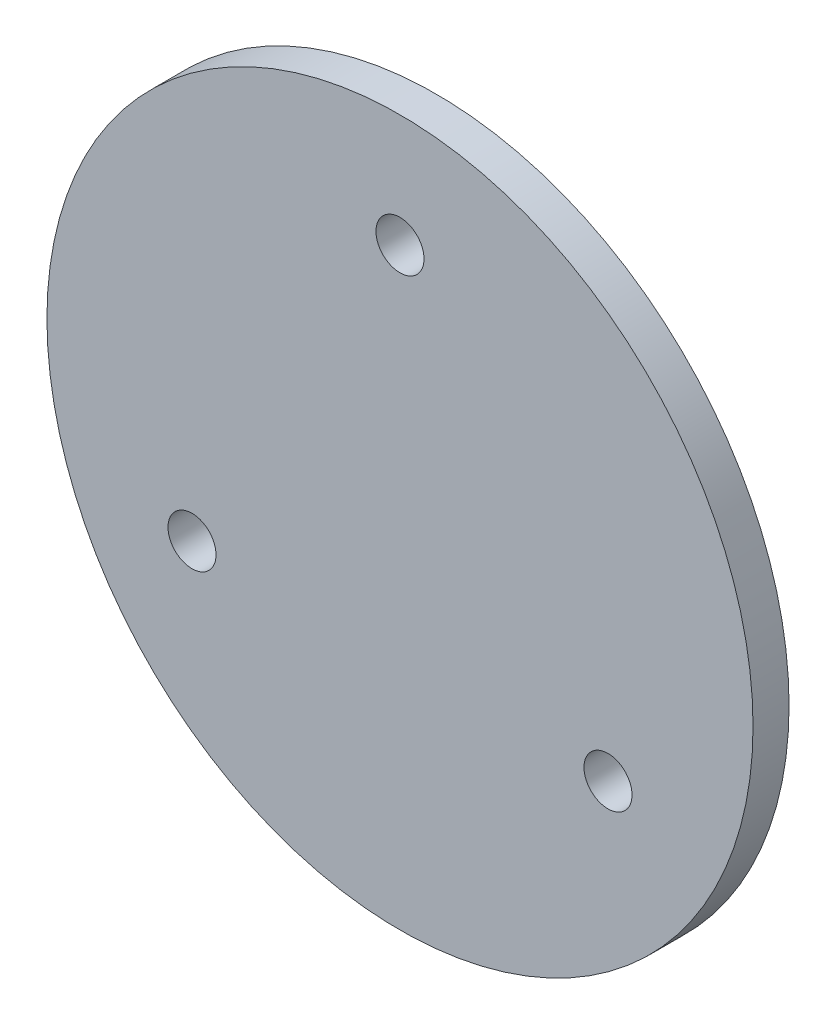
ISO-10303-21;
HEADER;
FILE_DESCRIPTION(('STEP AP214'),'2;1');
FILE_NAME('part.step','',(''),(''),'','','');
FILE_SCHEMA(('AUTOMOTIVE_DESIGN { 1 0 10303 214 1 1 1 1 }'));
ENDSEC;
DATA;
#1=APPLICATION_CONTEXT('core data for automotive mechanical design processes');
#2=APPLICATION_PROTOCOL_DEFINITION('international standard','automotive_design',2000,#1);
#3=PRODUCT_CONTEXT('',#1,'mechanical');
#4=PRODUCT('Part','Part','',(#3));
#5=PRODUCT_RELATED_PRODUCT_CATEGORY('part','',(#4));
#6=PRODUCT_DEFINITION_FORMATION('','',#4);
#7=PRODUCT_DEFINITION_CONTEXT('part definition',#1,'design');
#8=PRODUCT_DEFINITION('design','',#6,#7);
#9=PRODUCT_DEFINITION_SHAPE('','',#8);
#10=(LENGTH_UNIT() NAMED_UNIT(*) SI_UNIT(.MILLI.,.METRE.));
#11=(NAMED_UNIT(*) PLANE_ANGLE_UNIT() SI_UNIT($,.RADIAN.));
#12=(NAMED_UNIT(*) SI_UNIT($,.STERADIAN.) SOLID_ANGLE_UNIT());
#13=UNCERTAINTY_MEASURE_WITH_UNIT(LENGTH_MEASURE(1.E-05),#10,'distance_accuracy_value','');
#14=(GEOMETRIC_REPRESENTATION_CONTEXT(3) GLOBAL_UNCERTAINTY_ASSIGNED_CONTEXT((#13)) GLOBAL_UNIT_ASSIGNED_CONTEXT((#10,
#11,#12)) REPRESENTATION_CONTEXT('',''));
#15=CARTESIAN_POINT('',(0.,0.,0.));
#16=DIRECTION('',(0.,0.,1.));
#17=DIRECTION('',(1.,0.,0.));
#18=AXIS2_PLACEMENT_3D('',#15,#16,#17);
#19=CARTESIAN_POINT('',(11.5,11.,5.));
#20=DIRECTION('',(-1.,0.,0.));
#21=DIRECTION('',(0.,-1.,0.));
#22=AXIS2_PLACEMENT_3D('',#19,#20,#21);
#23=PLANE('',#22);
#24=DIRECTION('',(0.,1.,0.));
#25=VECTOR('',#24,1.);
#26=CARTESIAN_POINT('',(11.5,11.,0.));
#27=LINE('',#26,#25);
#28=CARTESIAN_POINT('',(11.5,-11.,0.));
#29=VERTEX_POINT('',#28);
#30=CARTESIAN_POINT('',(11.5,11.,0.));
#31=VERTEX_POINT('',#30);
#32=EDGE_CURVE('E109',#29,#31,#27,.T.);
#33=ORIENTED_EDGE('',*,*,#32,.T.);
#34=DIRECTION('',(0.,0.,-1.));
#35=VECTOR('',#34,1.);
#36=CARTESIAN_POINT('',(11.5,11.,5.));
#37=LINE('',#36,#35);
#38=CARTESIAN_POINT('',(11.5,11.,5.));
#39=VERTEX_POINT('',#38);
#40=EDGE_CURVE('E11',#39,#31,#37,.T.);
#41=ORIENTED_EDGE('',*,*,#40,.F.);
#42=DIRECTION('',(0.,1.,0.));
#43=VECTOR('',#42,1.);
#44=CARTESIAN_POINT('',(11.5,11.,5.));
#45=LINE('',#44,#43);
#46=CARTESIAN_POINT('',(11.5,-11.,5.));
#47=VERTEX_POINT('',#46);
#48=EDGE_CURVE('E88',#47,#39,#45,.T.);
#49=ORIENTED_EDGE('',*,*,#48,.F.);
#50=DIRECTION('',(0.,0.,-1.));
#51=VECTOR('',#50,1.);
#52=CARTESIAN_POINT('',(11.5,-11.,5.));
#53=LINE('',#52,#51);
#54=EDGE_CURVE('E90',#47,#29,#53,.T.);
#55=ORIENTED_EDGE('',*,*,#54,.T.);
#56=EDGE_LOOP('',(#33,#41,#49,#55));
#57=FACE_BOUND('',#56,.T.);
#58=ADVANCED_FACE('F39',(#57),#23,.F.);
#59=CARTESIAN_POINT('',(-11.5,11.,5.));
#60=DIRECTION('',(0.,-1.,0.));
#61=DIRECTION('',(0.,0.,-1.));
#62=AXIS2_PLACEMENT_3D('',#59,#60,#61);
#63=PLANE('',#62);
#64=DIRECTION('',(-1.,0.,0.));
#65=VECTOR('',#64,1.);
#66=CARTESIAN_POINT('',(-11.5,11.,0.));
#67=LINE('',#66,#65);
#68=CARTESIAN_POINT('',(-11.5,11.,0.));
#69=VERTEX_POINT('',#68);
#70=EDGE_CURVE('E112',#31,#69,#67,.T.);
#71=ORIENTED_EDGE('',*,*,#70,.T.);
#72=DIRECTION('',(0.,0.,-1.));
#73=VECTOR('',#72,1.);
#74=CARTESIAN_POINT('',(-11.5,11.,5.));
#75=LINE('',#74,#73);
#76=CARTESIAN_POINT('',(-11.5,11.,5.));
#77=VERTEX_POINT('',#76);
#78=EDGE_CURVE('E48',#77,#69,#75,.T.);
#79=ORIENTED_EDGE('',*,*,#78,.F.);
#80=DIRECTION('',(-1.,0.,0.));
#81=VECTOR('',#80,1.);
#82=CARTESIAN_POINT('',(-11.5,11.,5.));
#83=LINE('',#82,#81);
#84=EDGE_CURVE('E82',#39,#77,#83,.T.);
#85=ORIENTED_EDGE('',*,*,#84,.F.);
#86=ORIENTED_EDGE('',*,*,#40,.T.);
#87=EDGE_LOOP('',(#71,#79,#85,#86));
#88=FACE_BOUND('',#87,.T.);
#89=ADVANCED_FACE('F125',(#88),#63,.F.);
#90=CARTESIAN_POINT('',(-11.5,11.,5.));
#91=DIRECTION('',(1.,0.,0.));
#92=DIRECTION('',(0.,0.,-1.));
#93=AXIS2_PLACEMENT_3D('',#90,#91,#92);
#94=PLANE('',#93);
#95=DIRECTION('',(0.,-1.,0.));
#96=VECTOR('',#95,1.);
#97=CARTESIAN_POINT('',(-11.5,11.,0.));
#98=LINE('',#97,#96);
#99=CARTESIAN_POINT('',(-11.5,-11.,0.));
#100=VERTEX_POINT('',#99);
#101=EDGE_CURVE('E72',#69,#100,#98,.T.);
#102=ORIENTED_EDGE('',*,*,#101,.T.);
#103=DIRECTION('',(0.,0.,-1.));
#104=VECTOR('',#103,1.);
#105=CARTESIAN_POINT('',(-11.5,-11.,5.));
#106=LINE('',#105,#104);
#107=CARTESIAN_POINT('',(-11.5,-11.,5.));
#108=VERTEX_POINT('',#107);
#109=EDGE_CURVE('E56',#108,#100,#106,.T.);
#110=ORIENTED_EDGE('',*,*,#109,.F.);
#111=DIRECTION('',(0.,-1.,0.));
#112=VECTOR('',#111,1.);
#113=CARTESIAN_POINT('',(-11.5,11.,5.));
#114=LINE('',#113,#112);
#115=EDGE_CURVE('E102',#77,#108,#114,.T.);
#116=ORIENTED_EDGE('',*,*,#115,.F.);
#117=ORIENTED_EDGE('',*,*,#78,.T.);
#118=EDGE_LOOP('',(#102,#110,#116,#117));
#119=FACE_BOUND('',#118,.T.);
#120=ADVANCED_FACE('F122',(#119),#94,.F.);
#121=CARTESIAN_POINT('',(-11.5,-11.,5.));
#122=DIRECTION('',(0.,1.,0.));
#123=DIRECTION('',(0.,0.,1.));
#124=AXIS2_PLACEMENT_3D('',#121,#122,#123);
#125=PLANE('',#124);
#126=DIRECTION('',(1.,0.,0.));
#127=VECTOR('',#126,1.);
#128=CARTESIAN_POINT('',(-11.5,-11.,0.));
#129=LINE('',#128,#127);
#130=EDGE_CURVE('E77',#100,#29,#129,.T.);
#131=ORIENTED_EDGE('',*,*,#130,.T.);
#132=ORIENTED_EDGE('',*,*,#54,.F.);
#133=DIRECTION('',(1.,0.,0.));
#134=VECTOR('',#133,1.);
#135=CARTESIAN_POINT('',(-11.5,-11.,5.));
#136=LINE('',#135,#134);
#137=EDGE_CURVE('E97',#108,#47,#136,.T.);
#138=ORIENTED_EDGE('',*,*,#137,.F.);
#139=ORIENTED_EDGE('',*,*,#109,.T.);
#140=EDGE_LOOP('',(#131,#132,#138,#139));
#141=FACE_BOUND('',#140,.T.);
#142=ADVANCED_FACE('F96',(#141),#125,.F.);
#143=CARTESIAN_POINT('',(0.,0.,0.));
#144=DIRECTION('',(0.,0.,1.));
#145=DIRECTION('',(1.,0.,0.));
#146=AXIS2_PLACEMENT_3D('',#143,#144,#145);
#147=PLANE('',#146);
#148=ORIENTED_EDGE('',*,*,#32,.F.);
#149=ORIENTED_EDGE('',*,*,#130,.F.);
#150=ORIENTED_EDGE('',*,*,#101,.F.);
#151=ORIENTED_EDGE('',*,*,#70,.F.);
#152=EDGE_LOOP('',(#148,#149,#150,#151));
#153=FACE_BOUND('',#152,.T.);
#154=ADVANCED_FACE('F124',(#153),#147,.F.);
#155=CARTESIAN_POINT('',(0.,0.,5.));
#156=DIRECTION('',(0.,0.,1.));
#157=DIRECTION('',(1.,0.,0.));
#158=AXIS2_PLACEMENT_3D('',#155,#156,#157);
#159=PLANE('',#158);
#160=CARTESIAN_POINT('',(0.,20.,5.));
#161=DIRECTION('',(0.,0.,1.));
#162=DIRECTION('',(1.,0.,0.));
#163=AXIS2_PLACEMENT_3D('',#160,#161,#162);
#164=CIRCLE('',#163,2.);
#165=CARTESIAN_POINT('',(2.,20.,5.));
#166=VERTEX_POINT('',#165);
#167=EDGE_CURVE('E164',#166,#166,#164,.T.);
#168=ORIENTED_EDGE('',*,*,#167,.T.);
#169=EDGE_LOOP('',(#168));
#170=FACE_BOUND('',#169,.T.);
#171=CARTESIAN_POINT('',(17.3205080756896,-9.99999999999951,5.));
#172=DIRECTION('',(0.,0.,1.));
#173=DIRECTION('',(1.,0.,0.));
#174=AXIS2_PLACEMENT_3D('',#171,#172,#173);
#175=CIRCLE('',#174,2.00000000000076);
#176=CARTESIAN_POINT('',(19.3205080756904,-9.99999999999951,5.));
#177=VERTEX_POINT('',#176);
#178=EDGE_CURVE('E169',#177,#177,#175,.T.);
#179=ORIENTED_EDGE('',*,*,#178,.T.);
#180=EDGE_LOOP('',(#179));
#181=FACE_BOUND('',#180,.T.);
#182=CARTESIAN_POINT('',(-17.3205080756879,-10.0000000000005,5.));
#183=DIRECTION('',(0.,0.,1.));
#184=DIRECTION('',(1.,0.,0.));
#185=AXIS2_PLACEMENT_3D('',#182,#183,#184);
#186=CIRCLE('',#185,2.00000000000113);
#187=CARTESIAN_POINT('',(-15.3205080756868,-10.0000000000005,5.));
#188=VERTEX_POINT('',#187);
#189=EDGE_CURVE('E182',#188,#188,#186,.T.);
#190=ORIENTED_EDGE('',*,*,#189,.T.);
#191=EDGE_LOOP('',(#190));
#192=FACE_BOUND('',#191,.T.);
#193=CARTESIAN_POINT('',(0.,0.,5.));
#194=DIRECTION('',(0.,0.,1.));
#195=DIRECTION('',(1.,0.,0.));
#196=AXIS2_PLACEMENT_3D('',#193,#194,#195);
#197=CIRCLE('',#196,29.4);
#198=CARTESIAN_POINT('',(29.4,0.,5.));
#199=VERTEX_POINT('',#198);
#200=EDGE_CURVE('E173',#199,#199,#197,.T.);
#201=ORIENTED_EDGE('',*,*,#200,.F.);
#202=EDGE_LOOP('',(#201));
#203=FACE_BOUND('',#202,.T.);
#204=ORIENTED_EDGE('',*,*,#137,.T.);
#205=ORIENTED_EDGE('',*,*,#48,.T.);
#206=ORIENTED_EDGE('',*,*,#84,.T.);
#207=ORIENTED_EDGE('',*,*,#115,.T.);
#208=EDGE_LOOP('',(#204,#205,#206,#207));
#209=FACE_BOUND('',#208,.T.);
#210=ADVANCED_FACE('F101',(#170,#181,#192,#203,#209),#159,.F.);
#211=CARTESIAN_POINT('',(0.,0.,8.));
#212=DIRECTION('',(0.,0.,-1.));
#213=DIRECTION('',(-1.,0.,0.));
#214=AXIS2_PLACEMENT_3D('',#211,#212,#213);
#215=CYLINDRICAL_SURFACE('',#214,29.4);
#216=CARTESIAN_POINT('',(0.,0.,8.));
#217=DIRECTION('',(0.,0.,1.));
#218=DIRECTION('',(1.,0.,0.));
#219=AXIS2_PLACEMENT_3D('',#216,#217,#218);
#220=CIRCLE('',#219,29.4);
#221=CARTESIAN_POINT('',(29.4,0.,8.));
#222=VERTEX_POINT('',#221);
#223=EDGE_CURVE('E113',#222,#222,#220,.T.);
#224=ORIENTED_EDGE('',*,*,#223,.F.);
#225=EDGE_LOOP('',(#224));
#226=FACE_BOUND('',#225,.T.);
#227=ORIENTED_EDGE('',*,*,#200,.T.);
#228=EDGE_LOOP('',(#227));
#229=FACE_BOUND('',#228,.T.);
#230=ADVANCED_FACE('F137',(#226,#229),#215,.T.);
#231=CARTESIAN_POINT('',(0.,0.,8.));
#232=DIRECTION('',(0.,0.,1.));
#233=DIRECTION('',(1.,0.,0.));
#234=AXIS2_PLACEMENT_3D('',#231,#232,#233);
#235=PLANE('',#234);
#236=CARTESIAN_POINT('',(0.,20.,8.));
#237=DIRECTION('',(0.,0.,1.));
#238=DIRECTION('',(1.,0.,0.));
#239=AXIS2_PLACEMENT_3D('',#236,#237,#238);
#240=CIRCLE('',#239,2.);
#241=CARTESIAN_POINT('',(2.,20.,8.));
#242=VERTEX_POINT('',#241);
#243=EDGE_CURVE('E167',#242,#242,#240,.T.);
#244=ORIENTED_EDGE('',*,*,#243,.F.);
#245=EDGE_LOOP('',(#244));
#246=FACE_BOUND('',#245,.T.);
#247=CARTESIAN_POINT('',(17.3205080756896,-9.99999999999951,8.));
#248=DIRECTION('',(0.,0.,1.));
#249=DIRECTION('',(1.,0.,0.));
#250=AXIS2_PLACEMENT_3D('',#247,#248,#249);
#251=CIRCLE('',#250,2.00000000000076);
#252=CARTESIAN_POINT('',(19.3205080756904,-9.99999999999951,8.));
#253=VERTEX_POINT('',#252);
#254=EDGE_CURVE('E176',#253,#253,#251,.T.);
#255=ORIENTED_EDGE('',*,*,#254,.F.);
#256=EDGE_LOOP('',(#255));
#257=FACE_BOUND('',#256,.T.);
#258=CARTESIAN_POINT('',(-17.3205080756879,-10.0000000000005,8.));
#259=DIRECTION('',(0.,0.,1.));
#260=DIRECTION('',(1.,0.,0.));
#261=AXIS2_PLACEMENT_3D('',#258,#259,#260);
#262=CIRCLE('',#261,2.00000000000113);
#263=CARTESIAN_POINT('',(-15.3205080756868,-10.0000000000005,8.));
#264=VERTEX_POINT('',#263);
#265=EDGE_CURVE('E186',#264,#264,#262,.T.);
#266=ORIENTED_EDGE('',*,*,#265,.F.);
#267=EDGE_LOOP('',(#266));
#268=FACE_BOUND('',#267,.T.);
#269=ORIENTED_EDGE('',*,*,#223,.T.);
#270=EDGE_LOOP('',(#269));
#271=FACE_BOUND('',#270,.T.);
#272=ADVANCED_FACE('F140',(#246,#257,#268,#271),#235,.T.);
#273=CARTESIAN_POINT('',(-17.3205080756879,-10.0000000000005,5.));
#274=DIRECTION('',(0.,0.,1.));
#275=DIRECTION('',(1.,0.,0.));
#276=AXIS2_PLACEMENT_3D('',#273,#274,#275);
#277=CYLINDRICAL_SURFACE('',#276,2.00000000000113);
#278=ORIENTED_EDGE('',*,*,#189,.F.);
#279=EDGE_LOOP('',(#278));
#280=FACE_BOUND('',#279,.T.);
#281=ORIENTED_EDGE('',*,*,#265,.T.);
#282=EDGE_LOOP('',(#281));
#283=FACE_BOUND('',#282,.T.);
#284=ADVANCED_FACE('F147',(#280,#283),#277,.F.);
#285=CARTESIAN_POINT('',(17.3205080756896,-9.99999999999951,5.));
#286=DIRECTION('',(0.,0.,1.));
#287=DIRECTION('',(1.,0.,0.));
#288=AXIS2_PLACEMENT_3D('',#285,#286,#287);
#289=CYLINDRICAL_SURFACE('',#288,2.00000000000076);
#290=ORIENTED_EDGE('',*,*,#178,.F.);
#291=EDGE_LOOP('',(#290));
#292=FACE_BOUND('',#291,.T.);
#293=ORIENTED_EDGE('',*,*,#254,.T.);
#294=EDGE_LOOP('',(#293));
#295=FACE_BOUND('',#294,.T.);
#296=ADVANCED_FACE('F151',(#292,#295),#289,.F.);
#297=CARTESIAN_POINT('',(0.,20.,5.));
#298=DIRECTION('',(0.,0.,1.));
#299=DIRECTION('',(1.,0.,0.));
#300=AXIS2_PLACEMENT_3D('',#297,#298,#299);
#301=CYLINDRICAL_SURFACE('',#300,2.);
#302=ORIENTED_EDGE('',*,*,#167,.F.);
#303=EDGE_LOOP('',(#302));
#304=FACE_BOUND('',#303,.T.);
#305=ORIENTED_EDGE('',*,*,#243,.T.);
#306=EDGE_LOOP('',(#305));
#307=FACE_BOUND('',#306,.T.);
#308=ADVANCED_FACE('F155',(#304,#307),#301,.F.);
#309=CLOSED_SHELL('',(#58,#89,#120,#142,#154,#210,#230,#272,#284,#296,#308));
#310=MANIFOLD_SOLID_BREP('B2',#309);
#311=ADVANCED_BREP_SHAPE_REPRESENTATION('',(#18,#310),#14);
#312=SHAPE_DEFINITION_REPRESENTATION(#9,#311);
ENDSEC;
END-ISO-10303-21;
